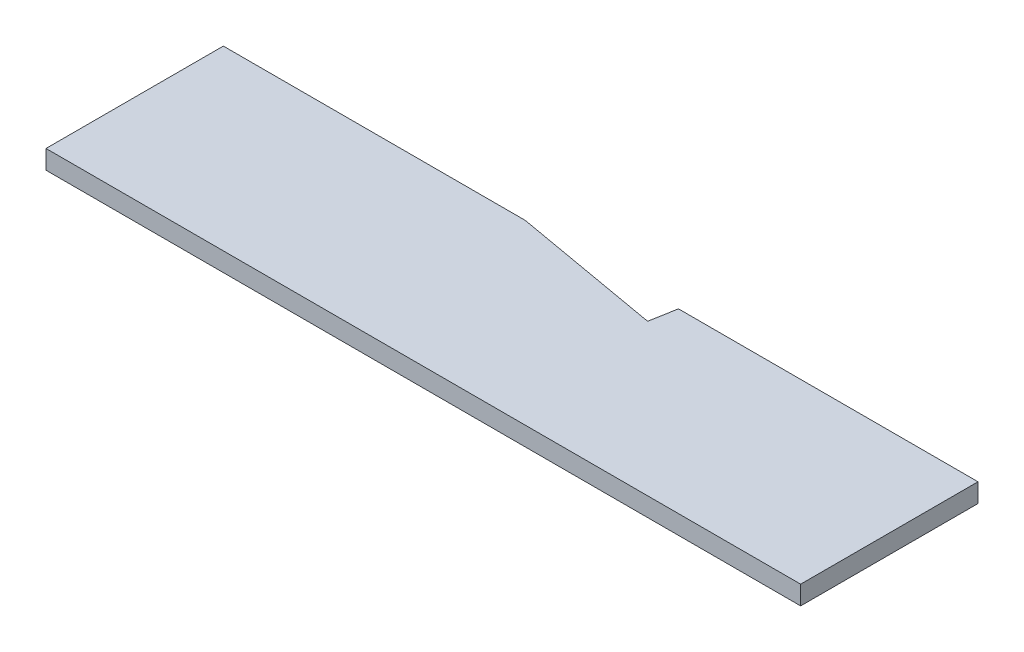
ISO-10303-21;
HEADER;
FILE_DESCRIPTION(('STEP AP214'),'2;1');
FILE_NAME('part.step','',(''),(''),'','','');
FILE_SCHEMA(('AUTOMOTIVE_DESIGN { 1 0 10303 214 1 1 1 1 }'));
ENDSEC;
DATA;
#1=APPLICATION_CONTEXT('core data for automotive mechanical design processes');
#2=APPLICATION_PROTOCOL_DEFINITION('international standard','automotive_design',2000,#1);
#3=PRODUCT_CONTEXT('',#1,'mechanical');
#4=PRODUCT('Part','Part','',(#3));
#5=PRODUCT_RELATED_PRODUCT_CATEGORY('part','',(#4));
#6=PRODUCT_DEFINITION_FORMATION('','',#4);
#7=PRODUCT_DEFINITION_CONTEXT('part definition',#1,'design');
#8=PRODUCT_DEFINITION('design','',#6,#7);
#9=PRODUCT_DEFINITION_SHAPE('','',#8);
#10=(LENGTH_UNIT() NAMED_UNIT(*) SI_UNIT(.MILLI.,.METRE.));
#11=(NAMED_UNIT(*) PLANE_ANGLE_UNIT() SI_UNIT($,.RADIAN.));
#12=(NAMED_UNIT(*) SI_UNIT($,.STERADIAN.) SOLID_ANGLE_UNIT());
#13=UNCERTAINTY_MEASURE_WITH_UNIT(LENGTH_MEASURE(1.E-05),#10,'distance_accuracy_value','');
#14=(GEOMETRIC_REPRESENTATION_CONTEXT(3) GLOBAL_UNCERTAINTY_ASSIGNED_CONTEXT((#13)) GLOBAL_UNIT_ASSIGNED_CONTEXT((#10,
#11,#12)) REPRESENTATION_CONTEXT('',''));
#15=CARTESIAN_POINT('',(0.,0.,0.));
#16=DIRECTION('',(0.,0.,1.));
#17=DIRECTION('',(1.,0.,0.));
#18=AXIS2_PLACEMENT_3D('',#15,#16,#17);
#19=CARTESIAN_POINT('',(0.,6.35,0.));
#20=DIRECTION('',(1.,0.,0.));
#21=DIRECTION('',(0.,0.,-1.));
#22=AXIS2_PLACEMENT_3D('',#19,#20,#21);
#23=PLANE('',#22);
#24=DIRECTION('',(0.,0.,1.));
#25=VECTOR('',#24,1.);
#26=CARTESIAN_POINT('',(0.,0.,0.));
#27=LINE('',#26,#25);
#28=CARTESIAN_POINT('',(0.,0.,-59.69));
#29=VERTEX_POINT('',#28);
#30=CARTESIAN_POINT('',(0.,0.,0.));
#31=VERTEX_POINT('',#30);
#32=EDGE_CURVE('E127',#29,#31,#27,.T.);
#33=ORIENTED_EDGE('',*,*,#32,.T.);
#34=DIRECTION('',(0.,-1.,0.));
#35=VECTOR('',#34,1.);
#36=CARTESIAN_POINT('',(0.,6.35,0.));
#37=LINE('',#36,#35);
#38=CARTESIAN_POINT('',(0.,6.35,0.));
#39=VERTEX_POINT('',#38);
#40=EDGE_CURVE('E11',#39,#31,#37,.T.);
#41=ORIENTED_EDGE('',*,*,#40,.F.);
#42=DIRECTION('',(0.,0.,1.));
#43=VECTOR('',#42,1.);
#44=CARTESIAN_POINT('',(0.,6.35,0.));
#45=LINE('',#44,#43);
#46=CARTESIAN_POINT('',(0.,6.35,-59.69));
#47=VERTEX_POINT('',#46);
#48=EDGE_CURVE('E140',#47,#39,#45,.T.);
#49=ORIENTED_EDGE('',*,*,#48,.F.);
#50=DIRECTION('',(0.,-1.,0.));
#51=VECTOR('',#50,1.);
#52=CARTESIAN_POINT('',(0.,6.35,-59.69));
#53=LINE('',#52,#51);
#54=EDGE_CURVE('E123',#47,#29,#53,.T.);
#55=ORIENTED_EDGE('',*,*,#54,.T.);
#56=EDGE_LOOP('',(#33,#41,#49,#55));
#57=FACE_BOUND('',#56,.T.);
#58=ADVANCED_FACE('F37',(#57),#23,.F.);
#59=CARTESIAN_POINT('',(0.,6.35,0.));
#60=DIRECTION('',(0.,0.,-1.));
#61=DIRECTION('',(-1.,0.,0.));
#62=AXIS2_PLACEMENT_3D('',#59,#60,#61);
#63=PLANE('',#62);
#64=DIRECTION('',(1.,0.,0.));
#65=VECTOR('',#64,1.);
#66=CARTESIAN_POINT('',(0.,0.,0.));
#67=LINE('',#66,#65);
#68=CARTESIAN_POINT('',(254.,0.,0.));
#69=VERTEX_POINT('',#68);
#70=EDGE_CURVE('E130',#31,#69,#67,.T.);
#71=ORIENTED_EDGE('',*,*,#70,.T.);
#72=DIRECTION('',(0.,-1.,0.));
#73=VECTOR('',#72,1.);
#74=CARTESIAN_POINT('',(254.,6.35,0.));
#75=LINE('',#74,#73);
#76=CARTESIAN_POINT('',(254.,6.35,0.));
#77=VERTEX_POINT('',#76);
#78=EDGE_CURVE('E45',#77,#69,#75,.T.);
#79=ORIENTED_EDGE('',*,*,#78,.F.);
#80=DIRECTION('',(1.,0.,0.));
#81=VECTOR('',#80,1.);
#82=CARTESIAN_POINT('',(0.,6.35,0.));
#83=LINE('',#82,#81);
#84=EDGE_CURVE('E93',#39,#77,#83,.T.);
#85=ORIENTED_EDGE('',*,*,#84,.F.);
#86=ORIENTED_EDGE('',*,*,#40,.T.);
#87=EDGE_LOOP('',(#71,#79,#85,#86));
#88=FACE_BOUND('',#87,.T.);
#89=ADVANCED_FACE('F166',(#88),#63,.F.);
#90=CARTESIAN_POINT('',(254.,6.35,0.));
#91=DIRECTION('',(-1.,0.,0.));
#92=DIRECTION('',(0.,0.,1.));
#93=AXIS2_PLACEMENT_3D('',#90,#91,#92);
#94=PLANE('',#93);
#95=DIRECTION('',(0.,0.,-1.));
#96=VECTOR('',#95,1.);
#97=CARTESIAN_POINT('',(254.,0.,0.));
#98=LINE('',#97,#96);
#99=CARTESIAN_POINT('',(254.,0.,-59.69));
#100=VERTEX_POINT('',#99);
#101=EDGE_CURVE('E133',#69,#100,#98,.T.);
#102=ORIENTED_EDGE('',*,*,#101,.T.);
#103=DIRECTION('',(0.,-1.,0.));
#104=VECTOR('',#103,1.);
#105=CARTESIAN_POINT('',(254.,6.35,-59.69));
#106=LINE('',#105,#104);
#107=CARTESIAN_POINT('',(254.,6.35,-59.69));
#108=VERTEX_POINT('',#107);
#109=EDGE_CURVE('E144',#108,#100,#106,.T.);
#110=ORIENTED_EDGE('',*,*,#109,.F.);
#111=DIRECTION('',(0.,0.,-1.));
#112=VECTOR('',#111,1.);
#113=CARTESIAN_POINT('',(254.,6.35,0.));
#114=LINE('',#113,#112);
#115=EDGE_CURVE('E152',#77,#108,#114,.T.);
#116=ORIENTED_EDGE('',*,*,#115,.F.);
#117=ORIENTED_EDGE('',*,*,#78,.T.);
#118=EDGE_LOOP('',(#102,#110,#116,#117));
#119=FACE_BOUND('',#118,.T.);
#120=ADVANCED_FACE('F150',(#119),#94,.F.);
#121=CARTESIAN_POINT('',(153.183671883796,6.35,-59.69));
#122=DIRECTION('',(0.,0.,1.));
#123=DIRECTION('',(1.,0.,0.));
#124=AXIS2_PLACEMENT_3D('',#121,#122,#123);
#125=PLANE('',#124);
#126=DIRECTION('',(-1.,0.,0.));
#127=VECTOR('',#126,1.);
#128=CARTESIAN_POINT('',(153.183671883796,0.,-59.69));
#129=LINE('',#128,#127);
#130=CARTESIAN_POINT('',(153.183671883796,0.,-59.69));
#131=VERTEX_POINT('',#130);
#132=EDGE_CURVE('E135',#100,#131,#129,.T.);
#133=ORIENTED_EDGE('',*,*,#132,.T.);
#134=DIRECTION('',(0.,-1.,0.));
#135=VECTOR('',#134,1.);
#136=CARTESIAN_POINT('',(153.183671883796,6.35,-59.69));
#137=LINE('',#136,#135);
#138=CARTESIAN_POINT('',(153.183671883796,6.35,-59.69));
#139=VERTEX_POINT('',#138);
#140=EDGE_CURVE('E118',#139,#131,#137,.T.);
#141=ORIENTED_EDGE('',*,*,#140,.F.);
#142=DIRECTION('',(-1.,0.,0.));
#143=VECTOR('',#142,1.);
#144=CARTESIAN_POINT('',(153.183671883796,6.35,-59.69));
#145=LINE('',#144,#143);
#146=EDGE_CURVE('E109',#108,#139,#145,.T.);
#147=ORIENTED_EDGE('',*,*,#146,.F.);
#148=ORIENTED_EDGE('',*,*,#109,.T.);
#149=EDGE_LOOP('',(#133,#141,#147,#148));
#150=FACE_BOUND('',#149,.T.);
#151=ADVANCED_FACE('F158',(#150),#125,.F.);
#152=CARTESIAN_POINT('',(151.62823385302,6.35,-50.8686725745199));
#153=DIRECTION('',(0.984807753012208,0.,0.173648177666931));
#154=DIRECTION('',(0.173648177666931,0.,-0.984807753012208));
#155=AXIS2_PLACEMENT_3D('',#152,#153,#154);
#156=PLANE('',#155);
#157=DIRECTION('',(-0.173648177666931,0.,0.984807753012208));
#158=VECTOR('',#157,1.);
#159=CARTESIAN_POINT('',(151.62823385302,0.,-50.8686725745199));
#160=LINE('',#159,#158);
#161=CARTESIAN_POINT('',(151.62823385302,0.,-50.8686725745199));
#162=VERTEX_POINT('',#161);
#163=EDGE_CURVE('E117',#131,#162,#160,.T.);
#164=ORIENTED_EDGE('',*,*,#163,.T.);
#165=DIRECTION('',(0.,-1.,0.));
#166=VECTOR('',#165,1.);
#167=CARTESIAN_POINT('',(151.62823385302,6.35,-50.8686725745199));
#168=LINE('',#167,#166);
#169=CARTESIAN_POINT('',(151.62823385302,6.35,-50.8686725745199));
#170=VERTEX_POINT('',#169);
#171=EDGE_CURVE('E114',#170,#162,#168,.T.);
#172=ORIENTED_EDGE('',*,*,#171,.F.);
#173=DIRECTION('',(-0.173648177666931,0.,0.984807753012208));
#174=VECTOR('',#173,1.);
#175=CARTESIAN_POINT('',(151.62823385302,6.35,-50.8686725745199));
#176=LINE('',#175,#174);
#177=EDGE_CURVE('E103',#139,#170,#176,.T.);
#178=ORIENTED_EDGE('',*,*,#177,.F.);
#179=ORIENTED_EDGE('',*,*,#140,.T.);
#180=EDGE_LOOP('',(#164,#172,#178,#179));
#181=FACE_BOUND('',#180,.T.);
#182=ADVANCED_FACE('F115',(#181),#156,.F.);
#183=CARTESIAN_POINT('',(101.6,6.35,-59.69));
#184=DIRECTION('',(-0.17364817766693,0.,0.984807753012208));
#185=DIRECTION('',(0.984807753012208,0.,0.17364817766693));
#186=AXIS2_PLACEMENT_3D('',#183,#184,#185);
#187=PLANE('',#186);
#188=DIRECTION('',(-0.984807753012208,0.,-0.17364817766693));
#189=VECTOR('',#188,1.);
#190=CARTESIAN_POINT('',(101.6,0.,-59.69));
#191=LINE('',#190,#189);
#192=CARTESIAN_POINT('',(101.6,0.,-59.69));
#193=VERTEX_POINT('',#192);
#194=EDGE_CURVE('E79',#162,#193,#191,.T.);
#195=ORIENTED_EDGE('',*,*,#194,.T.);
#196=DIRECTION('',(0.,-1.,0.));
#197=VECTOR('',#196,1.);
#198=CARTESIAN_POINT('',(101.6,6.35,-59.69));
#199=LINE('',#198,#197);
#200=CARTESIAN_POINT('',(101.6,6.35,-59.69));
#201=VERTEX_POINT('',#200);
#202=EDGE_CURVE('E119',#201,#193,#199,.T.);
#203=ORIENTED_EDGE('',*,*,#202,.F.);
#204=DIRECTION('',(-0.984807753012208,0.,-0.17364817766693));
#205=VECTOR('',#204,1.);
#206=CARTESIAN_POINT('',(101.6,6.35,-59.69));
#207=LINE('',#206,#205);
#208=EDGE_CURVE('E107',#170,#201,#207,.T.);
#209=ORIENTED_EDGE('',*,*,#208,.F.);
#210=ORIENTED_EDGE('',*,*,#171,.T.);
#211=EDGE_LOOP('',(#195,#203,#209,#210));
#212=FACE_BOUND('',#211,.T.);
#213=ADVANCED_FACE('F121',(#212),#187,.F.);
#214=CARTESIAN_POINT('',(0.,6.35,-59.69));
#215=DIRECTION('',(0.,0.,1.));
#216=DIRECTION('',(1.,0.,0.));
#217=AXIS2_PLACEMENT_3D('',#214,#215,#216);
#218=PLANE('',#217);
#219=DIRECTION('',(-1.,0.,0.));
#220=VECTOR('',#219,1.);
#221=CARTESIAN_POINT('',(0.,0.,-59.69));
#222=LINE('',#221,#220);
#223=EDGE_CURVE('E85',#193,#29,#222,.T.);
#224=ORIENTED_EDGE('',*,*,#223,.T.);
#225=ORIENTED_EDGE('',*,*,#54,.F.);
#226=DIRECTION('',(-1.,0.,0.));
#227=VECTOR('',#226,1.);
#228=CARTESIAN_POINT('',(0.,6.35,-59.69));
#229=LINE('',#228,#227);
#230=EDGE_CURVE('E53',#201,#47,#229,.T.);
#231=ORIENTED_EDGE('',*,*,#230,.F.);
#232=ORIENTED_EDGE('',*,*,#202,.T.);
#233=EDGE_LOOP('',(#224,#225,#231,#232));
#234=FACE_BOUND('',#233,.T.);
#235=ADVANCED_FACE('F180',(#234),#218,.F.);
#236=CARTESIAN_POINT('',(0.,6.35,0.));
#237=DIRECTION('',(0.,-1.,0.));
#238=DIRECTION('',(0.,0.,-1.));
#239=AXIS2_PLACEMENT_3D('',#236,#237,#238);
#240=PLANE('',#239);
#241=ORIENTED_EDGE('',*,*,#48,.T.);
#242=ORIENTED_EDGE('',*,*,#84,.T.);
#243=ORIENTED_EDGE('',*,*,#115,.T.);
#244=ORIENTED_EDGE('',*,*,#146,.T.);
#245=ORIENTED_EDGE('',*,*,#177,.T.);
#246=ORIENTED_EDGE('',*,*,#208,.T.);
#247=ORIENTED_EDGE('',*,*,#230,.T.);
#248=EDGE_LOOP('',(#241,#242,#243,#244,#245,#246,#247));
#249=FACE_BOUND('',#248,.T.);
#250=ADVANCED_FACE('F105',(#249),#240,.F.);
#251=CARTESIAN_POINT('',(0.,0.,0.));
#252=DIRECTION('',(0.,-1.,0.));
#253=DIRECTION('',(0.,0.,-1.));
#254=AXIS2_PLACEMENT_3D('',#251,#252,#253);
#255=PLANE('',#254);
#256=ORIENTED_EDGE('',*,*,#32,.F.);
#257=ORIENTED_EDGE('',*,*,#223,.F.);
#258=ORIENTED_EDGE('',*,*,#194,.F.);
#259=ORIENTED_EDGE('',*,*,#163,.F.);
#260=ORIENTED_EDGE('',*,*,#132,.F.);
#261=ORIENTED_EDGE('',*,*,#101,.F.);
#262=ORIENTED_EDGE('',*,*,#70,.F.);
#263=EDGE_LOOP('',(#256,#257,#258,#259,#260,#261,#262));
#264=FACE_BOUND('',#263,.T.);
#265=ADVANCED_FACE('F156',(#264),#255,.T.);
#266=CLOSED_SHELL('',(#58,#89,#120,#151,#182,#213,#235,#250,#265));
#267=MANIFOLD_SOLID_BREP('B2',#266);
#268=ADVANCED_BREP_SHAPE_REPRESENTATION('',(#18,#267),#14);
#269=SHAPE_DEFINITION_REPRESENTATION(#9,#268);
ENDSEC;
END-ISO-10303-21;
